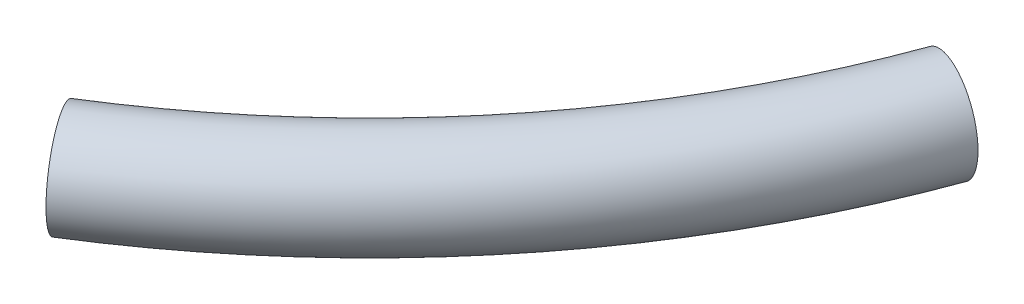
ISO-10303-21;
HEADER;
FILE_DESCRIPTION(('STEP AP214'),'2;1');
FILE_NAME('part.step','',(''),(''),'','','');
FILE_SCHEMA(('AUTOMOTIVE_DESIGN { 1 0 10303 214 1 1 1 1 }'));
ENDSEC;
DATA;
#1=APPLICATION_CONTEXT('core data for automotive mechanical design processes');
#2=APPLICATION_PROTOCOL_DEFINITION('international standard','automotive_design',2000,#1);
#3=PRODUCT_CONTEXT('',#1,'mechanical');
#4=PRODUCT('Part','Part','',(#3));
#5=PRODUCT_RELATED_PRODUCT_CATEGORY('part','',(#4));
#6=PRODUCT_DEFINITION_FORMATION('','',#4);
#7=PRODUCT_DEFINITION_CONTEXT('part definition',#1,'design');
#8=PRODUCT_DEFINITION('design','',#6,#7);
#9=PRODUCT_DEFINITION_SHAPE('','',#8);
#10=(LENGTH_UNIT() NAMED_UNIT(*) SI_UNIT(.MILLI.,.METRE.));
#11=(NAMED_UNIT(*) PLANE_ANGLE_UNIT() SI_UNIT($,.RADIAN.));
#12=(NAMED_UNIT(*) SI_UNIT($,.STERADIAN.) SOLID_ANGLE_UNIT());
#13=UNCERTAINTY_MEASURE_WITH_UNIT(LENGTH_MEASURE(1.E-05),#10,'distance_accuracy_value','');
#14=(GEOMETRIC_REPRESENTATION_CONTEXT(3) GLOBAL_UNCERTAINTY_ASSIGNED_CONTEXT((#13)) GLOBAL_UNIT_ASSIGNED_CONTEXT((#10,
#11,#12)) REPRESENTATION_CONTEXT('',''));
#15=CARTESIAN_POINT('',(0.,0.,0.));
#16=DIRECTION('',(0.,0.,1.));
#17=DIRECTION('',(1.,0.,0.));
#18=AXIS2_PLACEMENT_3D('',#15,#16,#17);
#19=CARTESIAN_POINT('',(0.,0.,0.));
#20=DIRECTION('',(0.342020143325663,0.,-0.939692620785911));
#21=DIRECTION('',(-0.939692620785911,0.,-0.342020143325663));
#22=AXIS2_PLACEMENT_3D('',#19,#20,#21);
#23=PLANE('',#22);
#24=CARTESIAN_POINT('',(7.35309475764975,4.2698,2.67630762152331));
#25=DIRECTION('',(0.342020143325663,0.,-0.939692620785911));
#26=DIRECTION('',(-0.939692620785911,0.,-0.342020143325663));
#27=AXIS2_PLACEMENT_3D('',#24,#25,#26);
#28=CIRCLE('',#27,0.4);
#29=CARTESIAN_POINT('',(7.72897180596411,4.2698,2.81311567885358));
#30=VERTEX_POINT('',#29);
#31=EDGE_CURVE('E10',#30,#30,#28,.T.);
#32=ORIENTED_EDGE('',*,*,#31,.T.);
#33=EDGE_LOOP('',(#32));
#34=FACE_BOUND('',#33,.T.);
#35=ADVANCED_FACE('F15',(#34),#23,.T.);
#36=CARTESIAN_POINT('',(0.,0.,0.));
#37=DIRECTION('',(0.848048096156424,0.,-0.529919264233209));
#38=DIRECTION('',(-0.529919264233209,0.,-0.848048096156424));
#39=AXIS2_PLACEMENT_3D('',#36,#37,#38);
#40=PLANE('',#39);
#41=CARTESIAN_POINT('',(4.14661824262486,4.2698,6.63597635242401));
#42=DIRECTION('',(0.848048096156424,0.,-0.529919264233209));
#43=DIRECTION('',(-0.52991926423321,0.,-0.848048096156423));
#44=AXIS2_PLACEMENT_3D('',#41,#42,#43);
#45=CIRCLE('',#44,0.4);
#46=CARTESIAN_POINT('',(4.35858594831815,4.2698,6.97519559088658));
#47=VERTEX_POINT('',#46);
#48=EDGE_CURVE('E22',#47,#47,#45,.T.);
#49=ORIENTED_EDGE('',*,*,#48,.F.);
#50=EDGE_LOOP('',(#49));
#51=FACE_BOUND('',#50,.T.);
#52=ADVANCED_FACE('F35',(#51),#40,.F.);
#53=CARTESIAN_POINT('',(0.,4.2698,0.));
#54=DIRECTION('',(0.,1.,0.));
#55=DIRECTION('',(0.342020143325663,0.,-0.939692620785911));
#56=AXIS2_PLACEMENT_3D('',#53,#54,#55);
#57=TOROIDAL_SURFACE('',#56,7.825,0.4);
#58=CARTESIAN_POINT('',(0.,4.2698,0.));
#59=DIRECTION('',(0.,1.,0.));
#60=DIRECTION('',(0.342020143325663,0.,-0.939692620785911));
#61=AXIS2_PLACEMENT_3D('',#58,#59,#60);
#62=CIRCLE('',#61,8.225);
#63=EDGE_CURVE('',#47,#30,#62,.T.);
#64=ORIENTED_EDGE('',*,*,#48,.T.);
#65=ORIENTED_EDGE('',*,*,#31,.F.);
#66=ORIENTED_EDGE('',*,*,#63,.T.);
#67=ORIENTED_EDGE('',*,*,#63,.F.);
#68=EDGE_LOOP('',(#64,#66,#65,#67));
#69=FACE_BOUND('',#68,.T.);
#70=ADVANCED_FACE('F33',(#69),#57,.T.);
#71=CLOSED_SHELL('',(#35,#52,#70));
#72=MANIFOLD_SOLID_BREP('B1',#71);
#73=ADVANCED_BREP_SHAPE_REPRESENTATION('',(#18,#72),#14);
#74=SHAPE_DEFINITION_REPRESENTATION(#9,#73);
ENDSEC;
END-ISO-10303-21;
